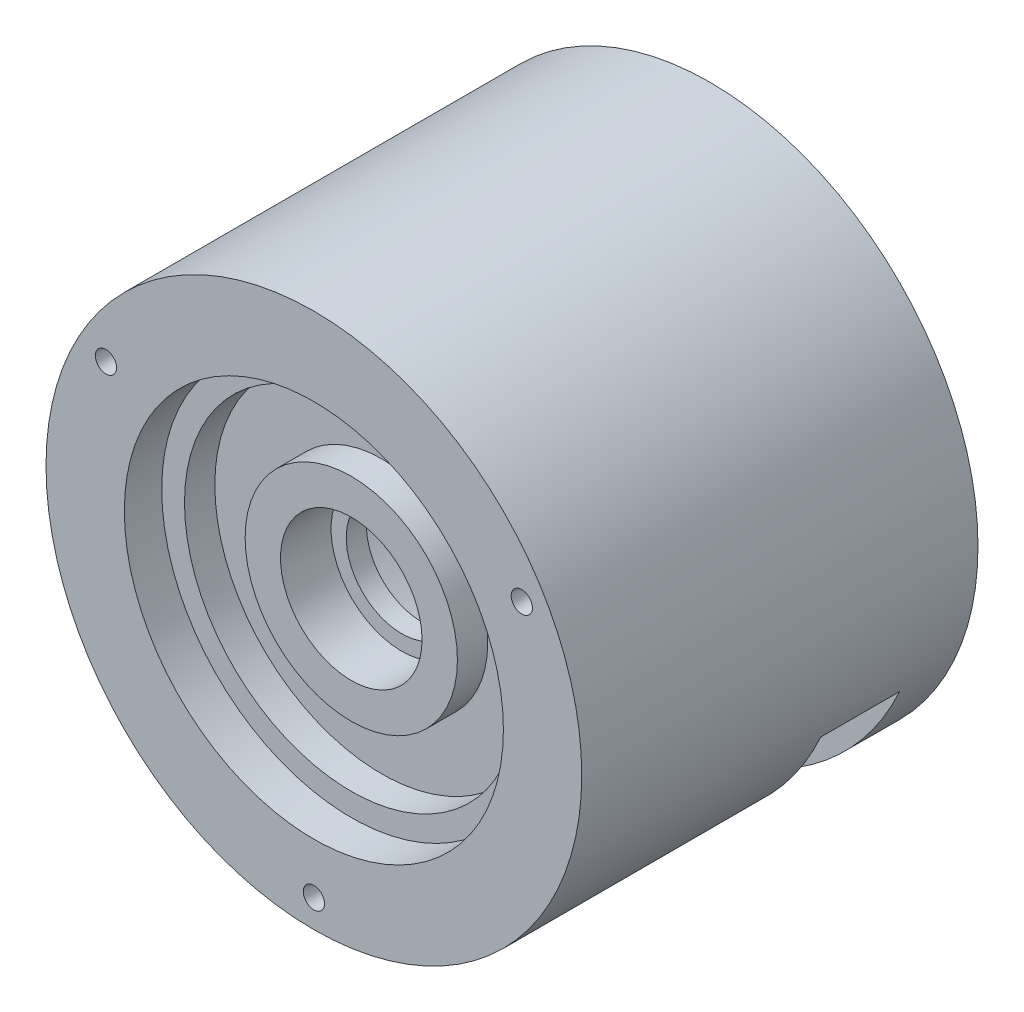
ISO-10303-21;
HEADER;
FILE_DESCRIPTION(('STEP AP214'),'2;1');
FILE_NAME('part.step','',(''),(''),'','','');
FILE_SCHEMA(('AUTOMOTIVE_DESIGN { 1 0 10303 214 1 1 1 1 }'));
ENDSEC;
DATA;
#1=APPLICATION_CONTEXT('core data for automotive mechanical design processes');
#2=APPLICATION_PROTOCOL_DEFINITION('international standard','automotive_design',2000,#1);
#3=PRODUCT_CONTEXT('',#1,'mechanical');
#4=PRODUCT('Part','Part','',(#3));
#5=PRODUCT_RELATED_PRODUCT_CATEGORY('part','',(#4));
#6=PRODUCT_DEFINITION_FORMATION('','',#4);
#7=PRODUCT_DEFINITION_CONTEXT('part definition',#1,'design');
#8=PRODUCT_DEFINITION('design','',#6,#7);
#9=PRODUCT_DEFINITION_SHAPE('','',#8);
#10=(LENGTH_UNIT() NAMED_UNIT(*) SI_UNIT(.MILLI.,.METRE.));
#11=(NAMED_UNIT(*) PLANE_ANGLE_UNIT() SI_UNIT($,.RADIAN.));
#12=(NAMED_UNIT(*) SI_UNIT($,.STERADIAN.) SOLID_ANGLE_UNIT());
#13=UNCERTAINTY_MEASURE_WITH_UNIT(LENGTH_MEASURE(1.E-05),#10,'distance_accuracy_value','');
#14=(GEOMETRIC_REPRESENTATION_CONTEXT(3) GLOBAL_UNCERTAINTY_ASSIGNED_CONTEXT((#13)) GLOBAL_UNIT_ASSIGNED_CONTEXT((#10,
#11,#12)) REPRESENTATION_CONTEXT('',''));
#15=CARTESIAN_POINT('',(0.,0.,0.));
#16=DIRECTION('',(0.,0.,1.));
#17=DIRECTION('',(1.,0.,0.));
#18=AXIS2_PLACEMENT_3D('',#15,#16,#17);
#19=CARTESIAN_POINT('',(0.,0.,10.123));
#20=DIRECTION('',(0.,0.,1.));
#21=DIRECTION('',(1.00000000000001,0.,0.));
#22=AXIS2_PLACEMENT_3D('',#19,#20,#21);
#23=CYLINDRICAL_SURFACE('',#22,20.);
#24=CARTESIAN_POINT('',(0.,0.,-11.7));
#25=DIRECTION('',(0.,0.,1.));
#26=DIRECTION('',(1.00000000000001,0.,0.));
#27=AXIS2_PLACEMENT_3D('',#24,#25,#26);
#28=CIRCLE('',#27,20.);
#29=CARTESIAN_POINT('',(20.0000000000001,0.,-11.7));
#30=VERTEX_POINT('',#29);
#31=EDGE_CURVE('E114',#30,#30,#28,.T.);
#32=ORIENTED_EDGE('',*,*,#31,.T.);
#33=EDGE_LOOP('',(#32));
#34=FACE_BOUND('',#33,.T.);
#35=CARTESIAN_POINT('',(0.,0.,-40.2));
#36=DIRECTION('',(0.,0.,1.));
#37=DIRECTION('',(1.00000000000001,0.,0.));
#38=AXIS2_PLACEMENT_3D('',#35,#36,#37);
#39=CIRCLE('',#38,20.);
#40=CARTESIAN_POINT('',(20.0000000000001,0.,-40.2));
#41=VERTEX_POINT('',#40);
#42=EDGE_CURVE('E67',#41,#41,#39,.T.);
#43=ORIENTED_EDGE('',*,*,#42,.F.);
#44=EDGE_LOOP('',(#43));
#45=FACE_BOUND('',#44,.T.);
#46=ADVANCED_FACE('F36',(#34,#45),#23,.F.);
#47=CARTESIAN_POINT('',(20.0000000000001,0.,-40.2));
#48=DIRECTION('',(0.,0.,-1.));
#49=DIRECTION('',(-1.00000000000001,0.,0.));
#50=AXIS2_PLACEMENT_3D('',#47,#48,#49);
#51=PLANE('',#50);
#52=CARTESIAN_POINT('',(1.83880688453542E-13,-23.5000000000002,-40.2));
#53=DIRECTION('',(0.,0.,1.));
#54=DIRECTION('',(0.,1.00000000000001,0.));
#55=AXIS2_PLACEMENT_3D('',#52,#53,#54);
#56=CIRCLE('',#55,1.05);
#57=CARTESIAN_POINT('',(1.80616632761144E-13,-22.4500000000001,-40.2));
#58=VERTEX_POINT('',#57);
#59=EDGE_CURVE('E137',#58,#58,#56,.T.);
#60=ORIENTED_EDGE('',*,*,#59,.T.);
#61=EDGE_LOOP('',(#60));
#62=FACE_BOUND('',#61,.T.);
#63=CARTESIAN_POINT('',(23.5000000000002,1.16226472890446E-13,-40.2));
#64=DIRECTION('',(0.,0.,1.));
#65=DIRECTION('',(-1.00000000000001,0.,0.));
#66=AXIS2_PLACEMENT_3D('',#63,#64,#65);
#67=CIRCLE('',#66,1.05);
#68=CARTESIAN_POINT('',(22.4500000000002,1.16255616244842E-13,-40.2));
#69=VERTEX_POINT('',#68);
#70=EDGE_CURVE('E131',#69,#69,#67,.T.);
#71=ORIENTED_EDGE('',*,*,#70,.T.);
#72=EDGE_LOOP('',(#71));
#73=FACE_BOUND('',#72,.T.);
#74=CARTESIAN_POINT('',(-3.36536354339501E-13,23.5000000000001,-40.2));
#75=DIRECTION('',(0.,0.,1.));
#76=DIRECTION('',(0.,-1.00000000000001,0.));
#77=AXIS2_PLACEMENT_3D('',#74,#75,#76);
#78=CIRCLE('',#77,1.05);
#79=CARTESIAN_POINT('',(-3.25607596440847E-13,22.4500000000001,-40.2));
#80=VERTEX_POINT('',#79);
#81=EDGE_CURVE('E124',#80,#80,#78,.T.);
#82=ORIENTED_EDGE('',*,*,#81,.T.);
#83=EDGE_LOOP('',(#82));
#84=FACE_BOUND('',#83,.T.);
#85=CARTESIAN_POINT('',(-23.5000000000001,0.,-40.2));
#86=DIRECTION('',(0.,0.,1.));
#87=DIRECTION('',(1.00000000000001,0.,0.));
#88=AXIS2_PLACEMENT_3D('',#85,#86,#87);
#89=CIRCLE('',#88,1.05);
#90=CARTESIAN_POINT('',(-22.4500000000001,0.,-40.2));
#91=VERTEX_POINT('',#90);
#92=EDGE_CURVE('E118',#91,#91,#89,.T.);
#93=ORIENTED_EDGE('',*,*,#92,.T.);
#94=EDGE_LOOP('',(#93));
#95=FACE_BOUND('',#94,.T.);
#96=ORIENTED_EDGE('',*,*,#42,.T.);
#97=EDGE_LOOP('',(#96));
#98=FACE_BOUND('',#97,.T.);
#99=CARTESIAN_POINT('',(0.,0.,-40.2));
#100=DIRECTION('',(0.,0.,1.));
#101=DIRECTION('',(1.00000000000001,0.,0.));
#102=AXIS2_PLACEMENT_3D('',#99,#100,#101);
#103=CIRCLE('',#102,26.5);
#104=CARTESIAN_POINT('',(26.5000000000002,0.,-40.2));
#105=VERTEX_POINT('',#104);
#106=EDGE_CURVE('E78',#105,#105,#103,.T.);
#107=ORIENTED_EDGE('',*,*,#106,.F.);
#108=EDGE_LOOP('',(#107));
#109=FACE_BOUND('',#108,.T.);
#110=ADVANCED_FACE('F245',(#62,#73,#84,#95,#98,#109),#51,.T.);
#111=CARTESIAN_POINT('',(0.,0.,10.123));
#112=DIRECTION('',(0.,0.,1.));
#113=DIRECTION('',(1.00000000000001,0.,0.));
#114=AXIS2_PLACEMENT_3D('',#111,#112,#113);
#115=CYLINDRICAL_SURFACE('',#114,26.5);
#116=DIRECTION('',(0.,0.,1.));
#117=VECTOR('',#116,1.);
#118=CARTESIAN_POINT('',(10.9217700682799,-24.1446668764685,10.123));
#119=LINE('',#118,#117);
#120=CARTESIAN_POINT('',(10.9217700682799,-24.1446668764685,-27.));
#121=VERTEX_POINT('',#120);
#122=CARTESIAN_POINT('',(10.9217700682799,-24.1446668764685,-34.8));
#123=VERTEX_POINT('',#122);
#124=EDGE_CURVE('E11',#121,#123,#119,.F.);
#125=ORIENTED_EDGE('',*,*,#124,.F.);
#126=CARTESIAN_POINT('',(0.,0.,-27.));
#127=DIRECTION('',(0.,0.,-1.));
#128=DIRECTION('',(-1.00000000000001,0.,0.));
#129=AXIS2_PLACEMENT_3D('',#126,#127,#128);
#130=CIRCLE('',#129,26.5);
#131=CARTESIAN_POINT('',(24.1446668764685,-10.92177006828,-27.));
#132=VERTEX_POINT('',#131);
#133=EDGE_CURVE('E43',#121,#132,#130,.F.);
#134=ORIENTED_EDGE('',*,*,#133,.T.);
#135=DIRECTION('',(0.,0.,1.));
#136=VECTOR('',#135,1.);
#137=CARTESIAN_POINT('',(24.1446668764685,-10.92177006828,10.123));
#138=LINE('',#137,#136);
#139=CARTESIAN_POINT('',(24.1446668764685,-10.92177006828,-34.8));
#140=VERTEX_POINT('',#139);
#141=EDGE_CURVE('E59',#140,#132,#138,.T.);
#142=ORIENTED_EDGE('',*,*,#141,.F.);
#143=CARTESIAN_POINT('',(0.,0.,-34.8));
#144=DIRECTION('',(0.,0.,1.));
#145=DIRECTION('',(1.00000000000001,0.,0.));
#146=AXIS2_PLACEMENT_3D('',#143,#144,#145);
#147=CIRCLE('',#146,26.5);
#148=EDGE_CURVE('E66',#140,#123,#147,.F.);
#149=ORIENTED_EDGE('',*,*,#148,.T.);
#150=EDGE_LOOP('',(#125,#134,#142,#149));
#151=FACE_BOUND('',#150,.T.);
#152=ORIENTED_EDGE('',*,*,#106,.T.);
#153=EDGE_LOOP('',(#152));
#154=FACE_BOUND('',#153,.T.);
#155=CARTESIAN_POINT('',(0.,0.,-1.));
#156=DIRECTION('',(0.,0.,1.));
#157=DIRECTION('',(1.00000000000001,0.,0.));
#158=AXIS2_PLACEMENT_3D('',#155,#156,#157);
#159=CIRCLE('',#158,26.5);
#160=CARTESIAN_POINT('',(26.5000000000002,0.,-1.));
#161=VERTEX_POINT('',#160);
#162=EDGE_CURVE('E81',#161,#161,#159,.T.);
#163=ORIENTED_EDGE('',*,*,#162,.F.);
#164=EDGE_LOOP('',(#163));
#165=FACE_BOUND('',#164,.T.);
#166=ADVANCED_FACE('F72',(#151,#154,#165),#115,.T.);
#167=CARTESIAN_POINT('',(26.5000000000002,0.,-1.));
#168=DIRECTION('',(0.,0.,1.));
#169=DIRECTION('',(1.00000000000001,0.,0.));
#170=AXIS2_PLACEMENT_3D('',#167,#168,#169);
#171=PLANE('',#170);
#172=CARTESIAN_POINT('',(1.85615411929518E-13,-23.7500000000002,-1.));
#173=DIRECTION('',(0.,0.,1.));
#174=DIRECTION('',(-0.500000000000007,0.866025403784444,0.));
#175=AXIS2_PLACEMENT_3D('',#172,#173,#174);
#176=CIRCLE('',#175,1.05000000000003);
#177=CARTESIAN_POINT('',(-0.524999999999839,-22.8406733260265,-1.));
#178=VERTEX_POINT('',#177);
#179=EDGE_CURVE('E154',#178,#178,#176,.T.);
#180=ORIENTED_EDGE('',*,*,#179,.F.);
#181=EDGE_LOOP('',(#180));
#182=FACE_BOUND('',#181,.T.);
#183=CARTESIAN_POINT('',(20.5681033398805,11.8750000000003,-1.));
#184=DIRECTION('',(0.,0.,1.));
#185=DIRECTION('',(-0.499999999999996,-0.86602540378445,0.));
#186=AXIS2_PLACEMENT_3D('',#183,#184,#185);
#187=CIRCLE('',#186,1.05000000000003);
#188=CARTESIAN_POINT('',(20.0431033398805,10.9656733260266,-1.));
#189=VERTEX_POINT('',#188);
#190=EDGE_CURVE('E148',#189,#189,#187,.T.);
#191=ORIENTED_EDGE('',*,*,#190,.F.);
#192=EDGE_LOOP('',(#191));
#193=FACE_BOUND('',#192,.T.);
#194=CARTESIAN_POINT('',(-20.5681033398806,11.875,-1.));
#195=DIRECTION('',(0.,0.,1.));
#196=DIRECTION('',(1.00000000000001,0.,0.));
#197=AXIS2_PLACEMENT_3D('',#194,#195,#196);
#198=CIRCLE('',#197,1.05000000000003);
#199=CARTESIAN_POINT('',(-19.5181033398806,11.875,-1.));
#200=VERTEX_POINT('',#199);
#201=EDGE_CURVE('E142',#200,#200,#198,.T.);
#202=ORIENTED_EDGE('',*,*,#201,.F.);
#203=EDGE_LOOP('',(#202));
#204=FACE_BOUND('',#203,.T.);
#205=ORIENTED_EDGE('',*,*,#162,.T.);
#206=EDGE_LOOP('',(#205));
#207=FACE_BOUND('',#206,.T.);
#208=CARTESIAN_POINT('',(0.,0.,-1.));
#209=DIRECTION('',(0.,0.,1.));
#210=DIRECTION('',(1.00000000000001,0.,0.));
#211=AXIS2_PLACEMENT_3D('',#208,#209,#210);
#212=CIRCLE('',#211,18.75);
#213=CARTESIAN_POINT('',(18.7500000000001,0.,-1.));
#214=VERTEX_POINT('',#213);
#215=EDGE_CURVE('E84',#214,#214,#212,.T.);
#216=ORIENTED_EDGE('',*,*,#215,.F.);
#217=EDGE_LOOP('',(#216));
#218=FACE_BOUND('',#217,.T.);
#219=ADVANCED_FACE('F170',(#182,#193,#204,#207,#218),#171,.T.);
#220=CARTESIAN_POINT('',(0.,0.,10.123));
#221=DIRECTION('',(0.,0.,1.));
#222=DIRECTION('',(1.00000000000001,0.,0.));
#223=AXIS2_PLACEMENT_3D('',#220,#221,#222);
#224=CYLINDRICAL_SURFACE('',#223,18.75);
#225=ORIENTED_EDGE('',*,*,#215,.T.);
#226=EDGE_LOOP('',(#225));
#227=FACE_BOUND('',#226,.T.);
#228=CARTESIAN_POINT('',(0.,0.,-4.7));
#229=DIRECTION('',(0.,0.,1.));
#230=DIRECTION('',(1.00000000000001,0.,0.));
#231=AXIS2_PLACEMENT_3D('',#228,#229,#230);
#232=CIRCLE('',#231,18.75);
#233=CARTESIAN_POINT('',(18.7500000000001,0.,-4.7));
#234=VERTEX_POINT('',#233);
#235=EDGE_CURVE('E87',#234,#234,#232,.T.);
#236=ORIENTED_EDGE('',*,*,#235,.F.);
#237=EDGE_LOOP('',(#236));
#238=FACE_BOUND('',#237,.T.);
#239=ADVANCED_FACE('F173',(#227,#238),#224,.F.);
#240=CARTESIAN_POINT('',(18.7500000000001,0.,-4.7));
#241=DIRECTION('',(0.,0.,1.));
#242=DIRECTION('',(1.00000000000001,0.,0.));
#243=AXIS2_PLACEMENT_3D('',#240,#241,#242);
#244=PLANE('',#243);
#245=ORIENTED_EDGE('',*,*,#235,.T.);
#246=EDGE_LOOP('',(#245));
#247=FACE_BOUND('',#246,.T.);
#248=CARTESIAN_POINT('',(0.,0.,-4.7));
#249=DIRECTION('',(0.,0.,1.));
#250=DIRECTION('',(1.00000000000001,0.,0.));
#251=AXIS2_PLACEMENT_3D('',#248,#249,#250);
#252=CIRCLE('',#251,16.5);
#253=CARTESIAN_POINT('',(16.5000000000001,0.,-4.7));
#254=VERTEX_POINT('',#253);
#255=EDGE_CURVE('E90',#254,#254,#252,.T.);
#256=ORIENTED_EDGE('',*,*,#255,.F.);
#257=EDGE_LOOP('',(#256));
#258=FACE_BOUND('',#257,.T.);
#259=ADVANCED_FACE('F185',(#247,#258),#244,.T.);
#260=CARTESIAN_POINT('',(0.,0.,10.123));
#261=DIRECTION('',(0.,0.,1.));
#262=DIRECTION('',(1.00000000000001,0.,0.));
#263=AXIS2_PLACEMENT_3D('',#260,#261,#262);
#264=CYLINDRICAL_SURFACE('',#263,16.5);
#265=ORIENTED_EDGE('',*,*,#255,.T.);
#266=EDGE_LOOP('',(#265));
#267=FACE_BOUND('',#266,.T.);
#268=CARTESIAN_POINT('',(0.,0.,-7.7));
#269=DIRECTION('',(0.,0.,1.));
#270=DIRECTION('',(1.00000000000001,0.,0.));
#271=AXIS2_PLACEMENT_3D('',#268,#269,#270);
#272=CIRCLE('',#271,16.5);
#273=CARTESIAN_POINT('',(16.5000000000001,0.,-7.7));
#274=VERTEX_POINT('',#273);
#275=EDGE_CURVE('E93',#274,#274,#272,.T.);
#276=ORIENTED_EDGE('',*,*,#275,.F.);
#277=EDGE_LOOP('',(#276));
#278=FACE_BOUND('',#277,.T.);
#279=ADVANCED_FACE('F191',(#267,#278),#264,.F.);
#280=CARTESIAN_POINT('',(16.5000000000001,0.,-7.7));
#281=DIRECTION('',(0.,0.,1.));
#282=DIRECTION('',(1.00000000000001,0.,0.));
#283=AXIS2_PLACEMENT_3D('',#280,#281,#282);
#284=PLANE('',#283);
#285=ORIENTED_EDGE('',*,*,#275,.T.);
#286=EDGE_LOOP('',(#285));
#287=FACE_BOUND('',#286,.T.);
#288=CARTESIAN_POINT('',(0.,0.,-7.7));
#289=DIRECTION('',(0.,0.,1.));
#290=DIRECTION('',(1.00000000000001,0.,0.));
#291=AXIS2_PLACEMENT_3D('',#288,#289,#290);
#292=CIRCLE('',#291,10.5);
#293=CARTESIAN_POINT('',(10.5000000000001,0.,-7.7));
#294=VERTEX_POINT('',#293);
#295=EDGE_CURVE('E96',#294,#294,#292,.T.);
#296=ORIENTED_EDGE('',*,*,#295,.F.);
#297=EDGE_LOOP('',(#296));
#298=FACE_BOUND('',#297,.T.);
#299=ADVANCED_FACE('F197',(#287,#298),#284,.T.);
#300=CARTESIAN_POINT('',(0.,0.,10.123));
#301=DIRECTION('',(0.,0.,1.));
#302=DIRECTION('',(1.00000000000001,0.,0.));
#303=AXIS2_PLACEMENT_3D('',#300,#301,#302);
#304=CYLINDRICAL_SURFACE('',#303,10.5);
#305=ORIENTED_EDGE('',*,*,#295,.T.);
#306=EDGE_LOOP('',(#305));
#307=FACE_BOUND('',#306,.T.);
#308=CARTESIAN_POINT('',(0.,0.,-4.7));
#309=DIRECTION('',(0.,0.,1.));
#310=DIRECTION('',(1.00000000000001,0.,0.));
#311=AXIS2_PLACEMENT_3D('',#308,#309,#310);
#312=CIRCLE('',#311,10.5);
#313=CARTESIAN_POINT('',(10.5000000000001,0.,-4.7));
#314=VERTEX_POINT('',#313);
#315=EDGE_CURVE('E99',#314,#314,#312,.T.);
#316=ORIENTED_EDGE('',*,*,#315,.F.);
#317=EDGE_LOOP('',(#316));
#318=FACE_BOUND('',#317,.T.);
#319=ADVANCED_FACE('F203',(#307,#318),#304,.T.);
#320=CARTESIAN_POINT('',(10.5000000000001,0.,-4.7));
#321=DIRECTION('',(0.,0.,1.));
#322=DIRECTION('',(1.00000000000001,0.,0.));
#323=AXIS2_PLACEMENT_3D('',#320,#321,#322);
#324=PLANE('',#323);
#325=ORIENTED_EDGE('',*,*,#315,.T.);
#326=EDGE_LOOP('',(#325));
#327=FACE_BOUND('',#326,.T.);
#328=CARTESIAN_POINT('',(0.,0.,-4.7));
#329=DIRECTION('',(0.,0.,1.));
#330=DIRECTION('',(1.00000000000001,0.,0.));
#331=AXIS2_PLACEMENT_3D('',#328,#329,#330);
#332=CIRCLE('',#331,7.);
#333=CARTESIAN_POINT('',(7.00000000000005,0.,-4.7));
#334=VERTEX_POINT('',#333);
#335=EDGE_CURVE('E102',#334,#334,#332,.T.);
#336=ORIENTED_EDGE('',*,*,#335,.F.);
#337=EDGE_LOOP('',(#336));
#338=FACE_BOUND('',#337,.T.);
#339=ADVANCED_FACE('F209',(#327,#338),#324,.T.);
#340=CARTESIAN_POINT('',(0.,0.,10.123));
#341=DIRECTION('',(0.,0.,1.));
#342=DIRECTION('',(1.00000000000001,0.,0.));
#343=AXIS2_PLACEMENT_3D('',#340,#341,#342);
#344=CYLINDRICAL_SURFACE('',#343,7.);
#345=ORIENTED_EDGE('',*,*,#335,.T.);
#346=EDGE_LOOP('',(#345));
#347=FACE_BOUND('',#346,.T.);
#348=CARTESIAN_POINT('',(0.,0.,-9.7));
#349=DIRECTION('',(0.,0.,1.));
#350=DIRECTION('',(1.00000000000001,0.,0.));
#351=AXIS2_PLACEMENT_3D('',#348,#349,#350);
#352=CIRCLE('',#351,7.);
#353=CARTESIAN_POINT('',(7.00000000000005,0.,-9.7));
#354=VERTEX_POINT('',#353);
#355=EDGE_CURVE('E105',#354,#354,#352,.T.);
#356=ORIENTED_EDGE('',*,*,#355,.F.);
#357=EDGE_LOOP('',(#356));
#358=FACE_BOUND('',#357,.T.);
#359=ADVANCED_FACE('F215',(#347,#358),#344,.F.);
#360=CARTESIAN_POINT('',(7.00000000000003,0.,-9.7));
#361=DIRECTION('',(0.,0.,1.));
#362=DIRECTION('',(1.00000000000001,0.,0.));
#363=AXIS2_PLACEMENT_3D('',#360,#361,#362);
#364=PLANE('',#363);
#365=ORIENTED_EDGE('',*,*,#355,.T.);
#366=EDGE_LOOP('',(#365));
#367=FACE_BOUND('',#366,.T.);
#368=CARTESIAN_POINT('',(0.,0.,-9.7));
#369=DIRECTION('',(0.,0.,1.));
#370=DIRECTION('',(1.00000000000001,0.,0.));
#371=AXIS2_PLACEMENT_3D('',#368,#369,#370);
#372=CIRCLE('',#371,5.5);
#373=CARTESIAN_POINT('',(5.50000000000004,0.,-9.7));
#374=VERTEX_POINT('',#373);
#375=EDGE_CURVE('E108',#374,#374,#372,.T.);
#376=ORIENTED_EDGE('',*,*,#375,.F.);
#377=EDGE_LOOP('',(#376));
#378=FACE_BOUND('',#377,.T.);
#379=ADVANCED_FACE('F221',(#367,#378),#364,.T.);
#380=CARTESIAN_POINT('',(0.,0.,10.123));
#381=DIRECTION('',(0.,0.,1.));
#382=DIRECTION('',(1.00000000000001,0.,0.));
#383=AXIS2_PLACEMENT_3D('',#380,#381,#382);
#384=CYLINDRICAL_SURFACE('',#383,5.5);
#385=ORIENTED_EDGE('',*,*,#375,.T.);
#386=EDGE_LOOP('',(#385));
#387=FACE_BOUND('',#386,.T.);
#388=CARTESIAN_POINT('',(0.,0.,-11.7));
#389=DIRECTION('',(0.,0.,1.));
#390=DIRECTION('',(1.00000000000001,0.,0.));
#391=AXIS2_PLACEMENT_3D('',#388,#389,#390);
#392=CIRCLE('',#391,5.5);
#393=CARTESIAN_POINT('',(5.50000000000004,0.,-11.7));
#394=VERTEX_POINT('',#393);
#395=EDGE_CURVE('E111',#394,#394,#392,.T.);
#396=ORIENTED_EDGE('',*,*,#395,.F.);
#397=EDGE_LOOP('',(#396));
#398=FACE_BOUND('',#397,.T.);
#399=ADVANCED_FACE('F227',(#387,#398),#384,.F.);
#400=CARTESIAN_POINT('',(5.50000000000006,0.,-11.7));
#401=DIRECTION('',(0.,0.,-1.));
#402=DIRECTION('',(-1.00000000000001,0.,0.));
#403=AXIS2_PLACEMENT_3D('',#400,#401,#402);
#404=PLANE('',#403);
#405=ORIENTED_EDGE('',*,*,#395,.T.);
#406=EDGE_LOOP('',(#405));
#407=FACE_BOUND('',#406,.T.);
#408=ORIENTED_EDGE('',*,*,#31,.F.);
#409=EDGE_LOOP('',(#408));
#410=FACE_BOUND('',#409,.T.);
#411=ADVANCED_FACE('F233',(#407,#410),#404,.T.);
#412=CARTESIAN_POINT('',(-23.5000000000001,0.,-32.2));
#413=DIRECTION('',(0.,0.,-1.));
#414=DIRECTION('',(-1.00000000000001,0.,0.));
#415=AXIS2_PLACEMENT_3D('',#412,#413,#414);
#416=CYLINDRICAL_SURFACE('',#415,1.05);
#417=CARTESIAN_POINT('',(-23.5000000000001,0.,-32.2));
#418=DIRECTION('',(0.,0.,1.));
#419=DIRECTION('',(1.00000000000001,0.,0.));
#420=AXIS2_PLACEMENT_3D('',#417,#418,#419);
#421=CIRCLE('',#420,1.05);
#422=CARTESIAN_POINT('',(-22.4500000000001,0.,-32.2));
#423=VERTEX_POINT('',#422);
#424=EDGE_CURVE('E117',#423,#423,#421,.T.);
#425=ORIENTED_EDGE('',*,*,#424,.T.);
#426=EDGE_LOOP('',(#425));
#427=FACE_BOUND('',#426,.T.);
#428=ORIENTED_EDGE('',*,*,#92,.F.);
#429=EDGE_LOOP('',(#428));
#430=FACE_BOUND('',#429,.T.);
#431=ADVANCED_FACE('F239',(#427,#430),#416,.F.);
#432=CARTESIAN_POINT('',(-23.5000000000001,0.,-32.2));
#433=DIRECTION('',(0.,0.,1.));
#434=DIRECTION('',(1.00000000000001,0.,0.));
#435=AXIS2_PLACEMENT_3D('',#432,#433,#434);
#436=PLANE('',#435);
#437=ORIENTED_EDGE('',*,*,#424,.F.);
#438=EDGE_LOOP('',(#437));
#439=FACE_BOUND('',#438,.T.);
#440=ADVANCED_FACE('F260',(#439),#436,.F.);
#441=CARTESIAN_POINT('',(-3.36536354339501E-13,23.5000000000001,-32.2));
#442=DIRECTION('',(0.,0.,-1.));
#443=DIRECTION('',(-1.00000000000001,0.,0.));
#444=AXIS2_PLACEMENT_3D('',#441,#442,#443);
#445=CYLINDRICAL_SURFACE('',#444,1.05);
#446=CARTESIAN_POINT('',(-3.36536354339501E-13,23.5000000000001,-32.2));
#447=DIRECTION('',(0.,0.,1.));
#448=DIRECTION('',(0.,-1.00000000000001,0.));
#449=AXIS2_PLACEMENT_3D('',#446,#447,#448);
#450=CIRCLE('',#449,1.05);
#451=CARTESIAN_POINT('',(-3.25607596440847E-13,22.4500000000001,-32.2));
#452=VERTEX_POINT('',#451);
#453=EDGE_CURVE('E127',#452,#452,#450,.T.);
#454=ORIENTED_EDGE('',*,*,#453,.T.);
#455=EDGE_LOOP('',(#454));
#456=FACE_BOUND('',#455,.T.);
#457=ORIENTED_EDGE('',*,*,#81,.F.);
#458=EDGE_LOOP('',(#457));
#459=FACE_BOUND('',#458,.T.);
#460=ADVANCED_FACE('F264',(#456,#459),#445,.F.);
#461=CARTESIAN_POINT('',(-3.36536354339501E-13,23.5000000000001,-32.2));
#462=DIRECTION('',(0.,0.,1.));
#463=DIRECTION('',(0.,-1.00000000000001,0.));
#464=AXIS2_PLACEMENT_3D('',#461,#462,#463);
#465=PLANE('',#464);
#466=ORIENTED_EDGE('',*,*,#453,.F.);
#467=EDGE_LOOP('',(#466));
#468=FACE_BOUND('',#467,.T.);
#469=ADVANCED_FACE('F268',(#468),#465,.F.);
#470=CARTESIAN_POINT('',(23.5000000000002,1.16226472890446E-13,-32.2));
#471=DIRECTION('',(0.,0.,-1.));
#472=DIRECTION('',(-1.00000000000001,0.,0.));
#473=AXIS2_PLACEMENT_3D('',#470,#471,#472);
#474=CYLINDRICAL_SURFACE('',#473,1.05);
#475=CARTESIAN_POINT('',(23.5000000000002,1.16226472890446E-13,-32.2));
#476=DIRECTION('',(0.,0.,1.));
#477=DIRECTION('',(-1.00000000000001,0.,0.));
#478=AXIS2_PLACEMENT_3D('',#475,#476,#477);
#479=CIRCLE('',#478,1.05);
#480=CARTESIAN_POINT('',(22.4500000000002,1.16255616244842E-13,-32.2));
#481=VERTEX_POINT('',#480);
#482=EDGE_CURVE('E134',#481,#481,#479,.T.);
#483=ORIENTED_EDGE('',*,*,#482,.T.);
#484=EDGE_LOOP('',(#483));
#485=FACE_BOUND('',#484,.T.);
#486=ORIENTED_EDGE('',*,*,#70,.F.);
#487=EDGE_LOOP('',(#486));
#488=FACE_BOUND('',#487,.T.);
#489=ADVANCED_FACE('F272',(#485,#488),#474,.F.);
#490=CARTESIAN_POINT('',(23.5000000000002,1.16226472890446E-13,-32.2));
#491=DIRECTION('',(0.,0.,1.));
#492=DIRECTION('',(-1.00000000000001,0.,0.));
#493=AXIS2_PLACEMENT_3D('',#490,#491,#492);
#494=PLANE('',#493);
#495=ORIENTED_EDGE('',*,*,#482,.F.);
#496=EDGE_LOOP('',(#495));
#497=FACE_BOUND('',#496,.T.);
#498=ADVANCED_FACE('F276',(#497),#494,.F.);
#499=CARTESIAN_POINT('',(1.83880688453542E-13,-23.5000000000002,-32.2));
#500=DIRECTION('',(0.,0.,-1.));
#501=DIRECTION('',(-1.00000000000001,0.,0.));
#502=AXIS2_PLACEMENT_3D('',#499,#500,#501);
#503=CYLINDRICAL_SURFACE('',#502,1.05);
#504=CARTESIAN_POINT('',(1.83880688453542E-13,-23.5000000000002,-32.2));
#505=DIRECTION('',(0.,0.,1.));
#506=DIRECTION('',(0.,1.00000000000001,0.));
#507=AXIS2_PLACEMENT_3D('',#504,#505,#506);
#508=CIRCLE('',#507,1.05);
#509=CARTESIAN_POINT('',(1.80616632761144E-13,-22.4500000000001,-32.2));
#510=VERTEX_POINT('',#509);
#511=EDGE_CURVE('E121',#510,#510,#508,.T.);
#512=ORIENTED_EDGE('',*,*,#511,.T.);
#513=EDGE_LOOP('',(#512));
#514=FACE_BOUND('',#513,.T.);
#515=ORIENTED_EDGE('',*,*,#59,.F.);
#516=EDGE_LOOP('',(#515));
#517=FACE_BOUND('',#516,.T.);
#518=ADVANCED_FACE('F280',(#514,#517),#503,.F.);
#519=CARTESIAN_POINT('',(1.83880688453542E-13,-23.5000000000002,-32.2));
#520=DIRECTION('',(0.,0.,1.));
#521=DIRECTION('',(0.,1.00000000000001,0.));
#522=AXIS2_PLACEMENT_3D('',#519,#520,#521);
#523=PLANE('',#522);
#524=ORIENTED_EDGE('',*,*,#511,.F.);
#525=EDGE_LOOP('',(#524));
#526=FACE_BOUND('',#525,.T.);
#527=ADVANCED_FACE('F284',(#526),#523,.F.);
#528=CARTESIAN_POINT('',(-20.5681033398806,11.875,-7.));
#529=DIRECTION('',(0.,0.,1.));
#530=DIRECTION('',(1.00000000000001,0.,0.));
#531=AXIS2_PLACEMENT_3D('',#528,#529,#530);
#532=CYLINDRICAL_SURFACE('',#531,1.05000000000003);
#533=CARTESIAN_POINT('',(-20.5681033398806,11.875,-7.));
#534=DIRECTION('',(0.,0.,1.));
#535=DIRECTION('',(1.00000000000001,0.,0.));
#536=AXIS2_PLACEMENT_3D('',#533,#534,#535);
#537=CIRCLE('',#536,1.05000000000003);
#538=CARTESIAN_POINT('',(-19.5181033398806,11.875,-7.));
#539=VERTEX_POINT('',#538);
#540=EDGE_CURVE('E128',#539,#539,#537,.T.);
#541=ORIENTED_EDGE('',*,*,#540,.F.);
#542=EDGE_LOOP('',(#541));
#543=FACE_BOUND('',#542,.T.);
#544=ORIENTED_EDGE('',*,*,#201,.T.);
#545=EDGE_LOOP('',(#544));
#546=FACE_BOUND('',#545,.T.);
#547=ADVANCED_FACE('F288',(#543,#546),#532,.F.);
#548=CARTESIAN_POINT('',(-20.5681033398806,11.875,-7.));
#549=DIRECTION('',(0.,0.,1.));
#550=DIRECTION('',(1.00000000000001,0.,0.));
#551=AXIS2_PLACEMENT_3D('',#548,#549,#550);
#552=PLANE('',#551);
#553=ORIENTED_EDGE('',*,*,#540,.T.);
#554=EDGE_LOOP('',(#553));
#555=FACE_BOUND('',#554,.T.);
#556=ADVANCED_FACE('F292',(#555),#552,.T.);
#557=CARTESIAN_POINT('',(20.5681033398805,11.8750000000003,-7.));
#558=DIRECTION('',(0.,0.,1.));
#559=DIRECTION('',(1.00000000000001,0.,0.));
#560=AXIS2_PLACEMENT_3D('',#557,#558,#559);
#561=CYLINDRICAL_SURFACE('',#560,1.05000000000003);
#562=CARTESIAN_POINT('',(20.5681033398805,11.8750000000003,-7.));
#563=DIRECTION('',(0.,0.,1.));
#564=DIRECTION('',(-0.499999999999996,-0.86602540378445,0.));
#565=AXIS2_PLACEMENT_3D('',#562,#563,#564);
#566=CIRCLE('',#565,1.05000000000003);
#567=CARTESIAN_POINT('',(20.0431033398805,10.9656733260266,-7.));
#568=VERTEX_POINT('',#567);
#569=EDGE_CURVE('E151',#568,#568,#566,.T.);
#570=ORIENTED_EDGE('',*,*,#569,.F.);
#571=EDGE_LOOP('',(#570));
#572=FACE_BOUND('',#571,.T.);
#573=ORIENTED_EDGE('',*,*,#190,.T.);
#574=EDGE_LOOP('',(#573));
#575=FACE_BOUND('',#574,.T.);
#576=ADVANCED_FACE('F296',(#572,#575),#561,.F.);
#577=CARTESIAN_POINT('',(20.5681033398805,11.8750000000003,-7.));
#578=DIRECTION('',(0.,0.,1.));
#579=DIRECTION('',(-0.499999999999996,-0.86602540378445,0.));
#580=AXIS2_PLACEMENT_3D('',#577,#578,#579);
#581=PLANE('',#580);
#582=ORIENTED_EDGE('',*,*,#569,.T.);
#583=EDGE_LOOP('',(#582));
#584=FACE_BOUND('',#583,.T.);
#585=ADVANCED_FACE('F166',(#584),#581,.T.);
#586=CARTESIAN_POINT('',(1.85615411929518E-13,-23.7500000000002,-7.));
#587=DIRECTION('',(0.,0.,1.));
#588=DIRECTION('',(1.00000000000001,0.,0.));
#589=AXIS2_PLACEMENT_3D('',#586,#587,#588);
#590=CYLINDRICAL_SURFACE('',#589,1.05000000000003);
#591=CARTESIAN_POINT('',(1.85615411929518E-13,-23.7500000000002,-7.));
#592=DIRECTION('',(0.,0.,1.));
#593=DIRECTION('',(-0.500000000000007,0.866025403784444,0.));
#594=AXIS2_PLACEMENT_3D('',#591,#592,#593);
#595=CIRCLE('',#594,1.05000000000003);
#596=CARTESIAN_POINT('',(-0.524999999999839,-22.8406733260265,-7.));
#597=VERTEX_POINT('',#596);
#598=EDGE_CURVE('E145',#597,#597,#595,.T.);
#599=ORIENTED_EDGE('',*,*,#598,.F.);
#600=EDGE_LOOP('',(#599));
#601=FACE_BOUND('',#600,.T.);
#602=ORIENTED_EDGE('',*,*,#179,.T.);
#603=EDGE_LOOP('',(#602));
#604=FACE_BOUND('',#603,.T.);
#605=ADVANCED_FACE('F163',(#601,#604),#590,.F.);
#606=CARTESIAN_POINT('',(1.85615411929518E-13,-23.7500000000002,-7.));
#607=DIRECTION('',(0.,0.,1.));
#608=DIRECTION('',(-0.500000000000007,0.866025403784444,0.));
#609=AXIS2_PLACEMENT_3D('',#606,#607,#608);
#610=PLANE('',#609);
#611=ORIENTED_EDGE('',*,*,#598,.T.);
#612=EDGE_LOOP('',(#611));
#613=FACE_BOUND('',#612,.T.);
#614=ADVANCED_FACE('F161',(#613),#610,.T.);
#615=CARTESIAN_POINT('',(11.8763642228816,-28.846926971359,-27.));
#616=DIRECTION('',(0.,0.,-1.));
#617=DIRECTION('',(-1.00000000000001,0.,0.));
#618=AXIS2_PLACEMENT_3D('',#615,#616,#617);
#619=PLANE('',#618);
#620=DIRECTION('',(-0.707106781186555,-0.707106781186553,0.));
#621=VECTOR('',#620,1.);
#622=CARTESIAN_POINT('',(9.04793709813551,-26.0184998466129,-27.));
#623=LINE('',#622,#621);
#624=EDGE_CURVE('E62',#132,#121,#623,.T.);
#625=ORIENTED_EDGE('',*,*,#624,.F.);
#626=ORIENTED_EDGE('',*,*,#133,.F.);
#627=EDGE_LOOP('',(#625,#626));
#628=FACE_BOUND('',#627,.T.);
#629=ADVANCED_FACE('F70',(#628),#619,.T.);
#630=CARTESIAN_POINT('',(28.846926971359,-11.8763642228818,-34.8));
#631=DIRECTION('',(0.,0.,1.));
#632=DIRECTION('',(1.00000000000001,0.,0.));
#633=AXIS2_PLACEMENT_3D('',#630,#631,#632);
#634=PLANE('',#633);
#635=DIRECTION('',(0.707106781186555,0.707106781186553,0.));
#636=VECTOR('',#635,1.);
#637=CARTESIAN_POINT('',(26.0184998466129,-9.04793709813561,-34.8));
#638=LINE('',#637,#636);
#639=EDGE_CURVE('E49',#123,#140,#638,.T.);
#640=ORIENTED_EDGE('',*,*,#639,.F.);
#641=ORIENTED_EDGE('',*,*,#148,.F.);
#642=EDGE_LOOP('',(#640,#641));
#643=FACE_BOUND('',#642,.T.);
#644=ADVANCED_FACE('F308',(#643),#634,.T.);
#645=CARTESIAN_POINT('',(17.5332184723742,-17.5332184723743,0.));
#646=DIRECTION('',(-0.707106781186553,0.707106781186555,0.));
#647=DIRECTION('',(-0.707106781186555,-0.707106781186553,0.));
#648=AXIS2_PLACEMENT_3D('',#645,#646,#647);
#649=PLANE('',#648);
#650=ORIENTED_EDGE('',*,*,#124,.T.);
#651=ORIENTED_EDGE('',*,*,#639,.T.);
#652=ORIENTED_EDGE('',*,*,#141,.T.);
#653=ORIENTED_EDGE('',*,*,#624,.T.);
#654=EDGE_LOOP('',(#650,#651,#652,#653));
#655=FACE_BOUND('',#654,.T.);
#656=ADVANCED_FACE('F61',(#655),#649,.F.);
#657=CLOSED_SHELL('',(#46,#110,#166,#219,#239,#259,#279,#299,#319,#339,#359,#379,#399,#411,#431,
#440,#460,#469,#489,#498,#518,#527,#547,#556,#576,#585,#605,#614,#629,#644,#656));
#658=MANIFOLD_SOLID_BREP('B2',#657);
#659=ADVANCED_BREP_SHAPE_REPRESENTATION('',(#18,#658),#14);
#660=SHAPE_DEFINITION_REPRESENTATION(#9,#659);
ENDSEC;
END-ISO-10303-21;
